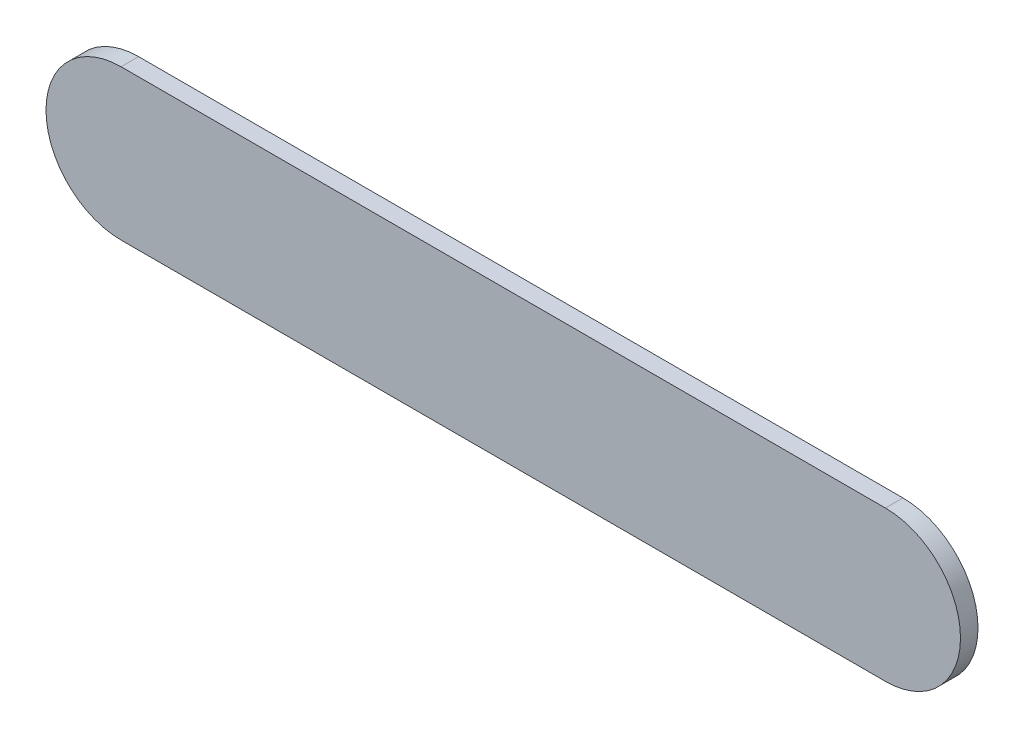
ISO-10303-21;
HEADER;
FILE_DESCRIPTION(('STEP AP214'),'2;1');
FILE_NAME('part.step','',(''),(''),'','','');
FILE_SCHEMA(('AUTOMOTIVE_DESIGN { 1 0 10303 214 1 1 1 1 }'));
ENDSEC;
DATA;
#1=APPLICATION_CONTEXT('core data for automotive mechanical design processes');
#2=APPLICATION_PROTOCOL_DEFINITION('international standard','automotive_design',2000,#1);
#3=PRODUCT_CONTEXT('',#1,'mechanical');
#4=PRODUCT('Part','Part','',(#3));
#5=PRODUCT_RELATED_PRODUCT_CATEGORY('part','',(#4));
#6=PRODUCT_DEFINITION_FORMATION('','',#4);
#7=PRODUCT_DEFINITION_CONTEXT('part definition',#1,'design');
#8=PRODUCT_DEFINITION('design','',#6,#7);
#9=PRODUCT_DEFINITION_SHAPE('','',#8);
#10=(LENGTH_UNIT() NAMED_UNIT(*) SI_UNIT(.MILLI.,.METRE.));
#11=(NAMED_UNIT(*) PLANE_ANGLE_UNIT() SI_UNIT($,.RADIAN.));
#12=(NAMED_UNIT(*) SI_UNIT($,.STERADIAN.) SOLID_ANGLE_UNIT());
#13=UNCERTAINTY_MEASURE_WITH_UNIT(LENGTH_MEASURE(1.E-05),#10,'distance_accuracy_value','');
#14=(GEOMETRIC_REPRESENTATION_CONTEXT(3) GLOBAL_UNCERTAINTY_ASSIGNED_CONTEXT((#13)) GLOBAL_UNIT_ASSIGNED_CONTEXT((#10,
#11,#12)) REPRESENTATION_CONTEXT('',''));
#15=CARTESIAN_POINT('',(0.,0.,0.));
#16=DIRECTION('',(0.,0.,1.));
#17=DIRECTION('',(1.,0.,0.));
#18=AXIS2_PLACEMENT_3D('',#15,#16,#17);
#19=CARTESIAN_POINT('',(123.0875,-62.85,1.635));
#20=DIRECTION('',(0.,0.,1.));
#21=DIRECTION('',(1.,0.,0.));
#22=AXIS2_PLACEMENT_3D('',#19,#20,#21);
#23=PLANE('',#22);
#24=DIRECTION('',(-1.,0.,0.));
#25=VECTOR('',#24,1.);
#26=CARTESIAN_POINT('',(123.0875,-62.85,1.635));
#27=LINE('',#26,#25);
#28=CARTESIAN_POINT('',(123.0875,-62.85,1.635));
#29=VERTEX_POINT('',#28);
#30=CARTESIAN_POINT('',(121.56,-62.85,1.635));
#31=VERTEX_POINT('',#30);
#32=EDGE_CURVE('E80',#29,#31,#27,.T.);
#33=ORIENTED_EDGE('',*,*,#32,.T.);
#34=CARTESIAN_POINT('',(121.56,-63.,1.635));
#35=DIRECTION('',(0.,0.,1.));
#36=DIRECTION('',(0.,1.,0.));
#37=AXIS2_PLACEMENT_3D('',#34,#35,#36);
#38=CIRCLE('',#37,0.15);
#39=CARTESIAN_POINT('',(121.56,-63.15,1.635));
#40=VERTEX_POINT('',#39);
#41=EDGE_CURVE('E66',#31,#40,#38,.T.);
#42=ORIENTED_EDGE('',*,*,#41,.T.);
#43=DIRECTION('',(1.,0.,0.));
#44=VECTOR('',#43,1.);
#45=CARTESIAN_POINT('',(121.56,-63.15,1.635));
#46=LINE('',#45,#44);
#47=CARTESIAN_POINT('',(123.0875,-63.15,1.635));
#48=VERTEX_POINT('',#47);
#49=EDGE_CURVE('E111',#40,#48,#46,.T.);
#50=ORIENTED_EDGE('',*,*,#49,.T.);
#51=CARTESIAN_POINT('',(123.0875,-63.,1.635));
#52=DIRECTION('',(0.,0.,1.));
#53=DIRECTION('',(0.,-1.,0.));
#54=AXIS2_PLACEMENT_3D('',#51,#52,#53);
#55=CIRCLE('',#54,0.15);
#56=EDGE_CURVE('E11',#48,#29,#55,.T.);
#57=ORIENTED_EDGE('',*,*,#56,.T.);
#58=EDGE_LOOP('',(#33,#42,#50,#57));
#59=FACE_BOUND('',#58,.T.);
#60=ADVANCED_FACE('F17',(#59),#23,.T.);
#61=CARTESIAN_POINT('',(123.0875,-62.85,1.6));
#62=DIRECTION('',(0.,0.,1.));
#63=DIRECTION('',(1.,0.,0.));
#64=AXIS2_PLACEMENT_3D('',#61,#62,#63);
#65=PLANE('',#64);
#66=CARTESIAN_POINT('',(123.0875,-63.,1.6));
#67=DIRECTION('',(0.,0.,1.));
#68=DIRECTION('',(0.,-1.,0.));
#69=AXIS2_PLACEMENT_3D('',#66,#67,#68);
#70=CIRCLE('',#69,0.15);
#71=CARTESIAN_POINT('',(123.0875,-63.15,1.6));
#72=VERTEX_POINT('',#71);
#73=CARTESIAN_POINT('',(123.0875,-62.85,1.6));
#74=VERTEX_POINT('',#73);
#75=EDGE_CURVE('E26',#72,#74,#70,.T.);
#76=ORIENTED_EDGE('',*,*,#75,.F.);
#77=DIRECTION('',(1.,0.,0.));
#78=VECTOR('',#77,1.);
#79=CARTESIAN_POINT('',(121.56,-63.15,1.6));
#80=LINE('',#79,#78);
#81=CARTESIAN_POINT('',(121.56,-63.15,1.6));
#82=VERTEX_POINT('',#81);
#83=EDGE_CURVE('E77',#82,#72,#80,.T.);
#84=ORIENTED_EDGE('',*,*,#83,.F.);
#85=CARTESIAN_POINT('',(121.56,-63.,1.6));
#86=DIRECTION('',(0.,0.,1.));
#87=DIRECTION('',(0.,1.,0.));
#88=AXIS2_PLACEMENT_3D('',#85,#86,#87);
#89=CIRCLE('',#88,0.15);
#90=CARTESIAN_POINT('',(121.56,-62.85,1.6));
#91=VERTEX_POINT('',#90);
#92=EDGE_CURVE('E103',#91,#82,#89,.T.);
#93=ORIENTED_EDGE('',*,*,#92,.F.);
#94=DIRECTION('',(-1.,0.,0.));
#95=VECTOR('',#94,1.);
#96=CARTESIAN_POINT('',(123.0875,-62.85,1.6));
#97=LINE('',#96,#95);
#98=EDGE_CURVE('E88',#74,#91,#97,.T.);
#99=ORIENTED_EDGE('',*,*,#98,.F.);
#100=EDGE_LOOP('',(#76,#84,#93,#99));
#101=FACE_BOUND('',#100,.T.);
#102=ADVANCED_FACE('F118',(#101),#65,.F.);
#103=CARTESIAN_POINT('',(123.0875,-63.,1.6));
#104=DIRECTION('',(0.,0.,-1.));
#105=DIRECTION('',(0.,-1.,0.));
#106=AXIS2_PLACEMENT_3D('',#103,#104,#105);
#107=CYLINDRICAL_SURFACE('',#106,0.15);
#108=ORIENTED_EDGE('',*,*,#75,.T.);
#109=DIRECTION('',(0.,0.,1.));
#110=VECTOR('',#109,1.);
#111=CARTESIAN_POINT('',(123.0875,-62.85,1.6));
#112=LINE('',#111,#110);
#113=EDGE_CURVE('E84',#74,#29,#112,.T.);
#114=ORIENTED_EDGE('',*,*,#113,.T.);
#115=ORIENTED_EDGE('',*,*,#56,.F.);
#116=DIRECTION('',(0.,0.,1.));
#117=VECTOR('',#116,1.);
#118=CARTESIAN_POINT('',(123.0875,-63.15,1.6));
#119=LINE('',#118,#117);
#120=EDGE_CURVE('E99',#72,#48,#119,.T.);
#121=ORIENTED_EDGE('',*,*,#120,.F.);
#122=EDGE_LOOP('',(#108,#114,#115,#121));
#123=FACE_BOUND('',#122,.T.);
#124=ADVANCED_FACE('F116',(#123),#107,.T.);
#125=CARTESIAN_POINT('',(121.56,-63.15,1.6));
#126=DIRECTION('',(0.,1.,0.));
#127=DIRECTION('',(1.,0.,0.));
#128=AXIS2_PLACEMENT_3D('',#125,#126,#127);
#129=PLANE('',#128);
#130=ORIENTED_EDGE('',*,*,#83,.T.);
#131=ORIENTED_EDGE('',*,*,#120,.T.);
#132=ORIENTED_EDGE('',*,*,#49,.F.);
#133=DIRECTION('',(0.,0.,1.));
#134=VECTOR('',#133,1.);
#135=CARTESIAN_POINT('',(121.56,-63.15,1.6));
#136=LINE('',#135,#134);
#137=EDGE_CURVE('E74',#82,#40,#136,.T.);
#138=ORIENTED_EDGE('',*,*,#137,.F.);
#139=EDGE_LOOP('',(#130,#131,#132,#138));
#140=FACE_BOUND('',#139,.T.);
#141=ADVANCED_FACE('F120',(#140),#129,.F.);
#142=CARTESIAN_POINT('',(121.56,-63.,1.6));
#143=DIRECTION('',(0.,0.,-1.));
#144=DIRECTION('',(0.,1.,0.));
#145=AXIS2_PLACEMENT_3D('',#142,#143,#144);
#146=CYLINDRICAL_SURFACE('',#145,0.15);
#147=ORIENTED_EDGE('',*,*,#92,.T.);
#148=ORIENTED_EDGE('',*,*,#137,.T.);
#149=ORIENTED_EDGE('',*,*,#41,.F.);
#150=DIRECTION('',(0.,0.,1.));
#151=VECTOR('',#150,1.);
#152=CARTESIAN_POINT('',(121.56,-62.85,1.6));
#153=LINE('',#152,#151);
#154=EDGE_CURVE('E71',#91,#31,#153,.T.);
#155=ORIENTED_EDGE('',*,*,#154,.F.);
#156=EDGE_LOOP('',(#147,#148,#149,#155));
#157=FACE_BOUND('',#156,.T.);
#158=ADVANCED_FACE('F69',(#157),#146,.T.);
#159=CARTESIAN_POINT('',(123.0875,-62.85,1.6));
#160=DIRECTION('',(0.,-1.,0.));
#161=DIRECTION('',(0.,0.,-1.));
#162=AXIS2_PLACEMENT_3D('',#159,#160,#161);
#163=PLANE('',#162);
#164=ORIENTED_EDGE('',*,*,#98,.T.);
#165=ORIENTED_EDGE('',*,*,#154,.T.);
#166=ORIENTED_EDGE('',*,*,#32,.F.);
#167=ORIENTED_EDGE('',*,*,#113,.F.);
#168=EDGE_LOOP('',(#164,#165,#166,#167));
#169=FACE_BOUND('',#168,.T.);
#170=ADVANCED_FACE('F86',(#169),#163,.F.);
#171=CLOSED_SHELL('',(#60,#102,#124,#141,#158,#170));
#172=MANIFOLD_SOLID_BREP('B1',#171);
#173=ADVANCED_BREP_SHAPE_REPRESENTATION('',(#18,#172),#14);
#174=SHAPE_DEFINITION_REPRESENTATION(#9,#173);
ENDSEC;
END-ISO-10303-21;
